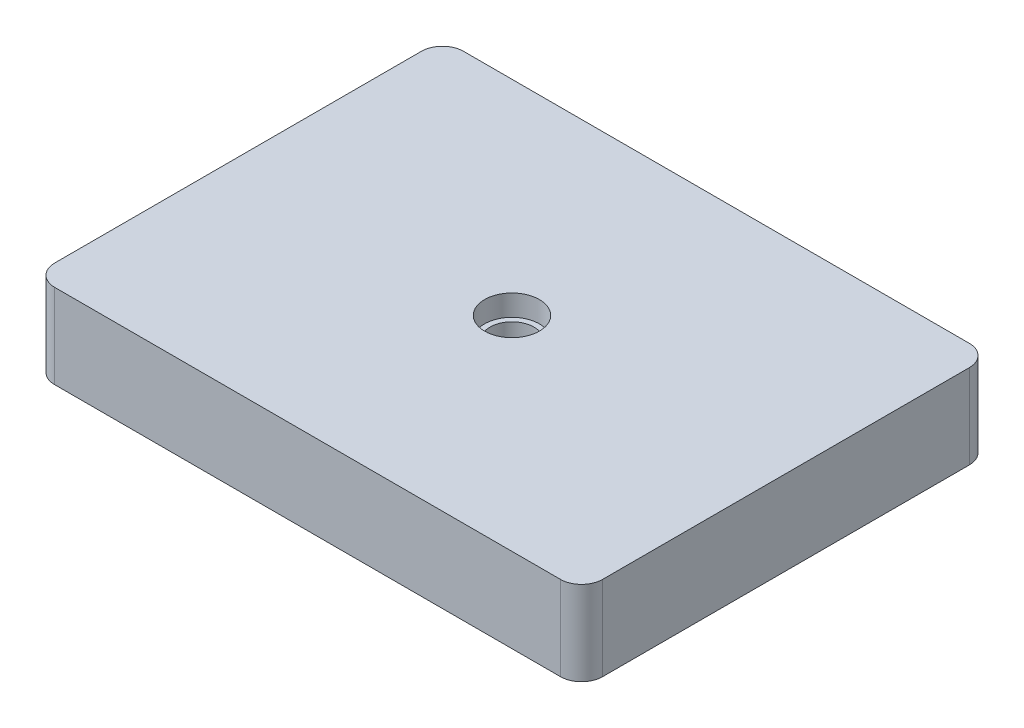
ISO-10303-21;
HEADER;
FILE_DESCRIPTION(('STEP AP214'),'2;1');
FILE_NAME('part.step','',(''),(''),'','','');
FILE_SCHEMA(('AUTOMOTIVE_DESIGN { 1 0 10303 214 1 1 1 1 }'));
ENDSEC;
DATA;
#1=APPLICATION_CONTEXT('core data for automotive mechanical design processes');
#2=APPLICATION_PROTOCOL_DEFINITION('international standard','automotive_design',2000,#1);
#3=PRODUCT_CONTEXT('',#1,'mechanical');
#4=PRODUCT('Part','Part','',(#3));
#5=PRODUCT_RELATED_PRODUCT_CATEGORY('part','',(#4));
#6=PRODUCT_DEFINITION_FORMATION('','',#4);
#7=PRODUCT_DEFINITION_CONTEXT('part definition',#1,'design');
#8=PRODUCT_DEFINITION('design','',#6,#7);
#9=PRODUCT_DEFINITION_SHAPE('','',#8);
#10=(LENGTH_UNIT() NAMED_UNIT(*) SI_UNIT(.MILLI.,.METRE.));
#11=(NAMED_UNIT(*) PLANE_ANGLE_UNIT() SI_UNIT($,.RADIAN.));
#12=(NAMED_UNIT(*) SI_UNIT($,.STERADIAN.) SOLID_ANGLE_UNIT());
#13=UNCERTAINTY_MEASURE_WITH_UNIT(LENGTH_MEASURE(1.E-05),#10,'distance_accuracy_value','');
#14=(GEOMETRIC_REPRESENTATION_CONTEXT(3) GLOBAL_UNCERTAINTY_ASSIGNED_CONTEXT((#13)) GLOBAL_UNIT_ASSIGNED_CONTEXT((#10,
#11,#12)) REPRESENTATION_CONTEXT('',''));
#15=CARTESIAN_POINT('',(0.,0.,0.));
#16=DIRECTION('',(0.,0.,1.));
#17=DIRECTION('',(1.,0.,0.));
#18=AXIS2_PLACEMENT_3D('',#15,#16,#17);
#19=CARTESIAN_POINT('',(0.,-20.,0.));
#20=DIRECTION('',(0.,1.,0.));
#21=DIRECTION('',(0.,0.,1.));
#22=AXIS2_PLACEMENT_3D('',#19,#20,#21);
#23=CYLINDRICAL_SURFACE('',#22,5.2);
#24=CARTESIAN_POINT('',(0.,-20.,0.));
#25=DIRECTION('',(0.,1.,0.));
#26=DIRECTION('',(0.,0.,1.));
#27=AXIS2_PLACEMENT_3D('',#24,#25,#26);
#28=CIRCLE('',#27,5.2);
#29=CARTESIAN_POINT('',(0.,-20.,5.2));
#30=VERTEX_POINT('',#29);
#31=EDGE_CURVE('E177',#30,#30,#28,.T.);
#32=ORIENTED_EDGE('',*,*,#31,.F.);
#33=EDGE_LOOP('',(#32));
#34=FACE_BOUND('',#33,.T.);
#35=CARTESIAN_POINT('',(0.,-5.,0.));
#36=DIRECTION('',(0.,1.,0.));
#37=DIRECTION('',(0.,0.,1.));
#38=AXIS2_PLACEMENT_3D('',#35,#36,#37);
#39=CIRCLE('',#38,5.2);
#40=CARTESIAN_POINT('',(0.,-5.,5.2));
#41=VERTEX_POINT('',#40);
#42=EDGE_CURVE('E139',#41,#41,#39,.F.);
#43=ORIENTED_EDGE('',*,*,#42,.F.);
#44=EDGE_LOOP('',(#43));
#45=FACE_BOUND('',#44,.T.);
#46=ADVANCED_FACE('F41',(#34,#45),#23,.F.);
#47=CARTESIAN_POINT('',(65.,-20.,48.5));
#48=DIRECTION('',(1.,0.,0.));
#49=DIRECTION('',(0.,0.,-1.));
#50=AXIS2_PLACEMENT_3D('',#47,#48,#49);
#51=PLANE('',#50);
#52=DIRECTION('',(0.,0.,-1.));
#53=VECTOR('',#52,1.);
#54=CARTESIAN_POINT('',(65.,-20.,48.5));
#55=LINE('',#54,#53);
#56=CARTESIAN_POINT('',(65.,-20.,43.5));
#57=VERTEX_POINT('',#56);
#58=CARTESIAN_POINT('',(65.,-20.,-43.5));
#59=VERTEX_POINT('',#58);
#60=EDGE_CURVE('E164',#57,#59,#55,.T.);
#61=ORIENTED_EDGE('',*,*,#60,.T.);
#62=DIRECTION('',(0.,1.,0.));
#63=VECTOR('',#62,1.);
#64=CARTESIAN_POINT('',(65.,-20.,-43.5));
#65=LINE('',#64,#63);
#66=CARTESIAN_POINT('',(65.,0.,-43.5));
#67=VERTEX_POINT('',#66);
#68=EDGE_CURVE('E11',#59,#67,#65,.T.);
#69=ORIENTED_EDGE('',*,*,#68,.T.);
#70=DIRECTION('',(0.,0.,-1.));
#71=VECTOR('',#70,1.);
#72=CARTESIAN_POINT('',(65.,0.,48.5));
#73=LINE('',#72,#71);
#74=CARTESIAN_POINT('',(65.,0.,43.5));
#75=VERTEX_POINT('',#74);
#76=EDGE_CURVE('E113',#75,#67,#73,.T.);
#77=ORIENTED_EDGE('',*,*,#76,.F.);
#78=DIRECTION('',(0.,1.,0.));
#79=VECTOR('',#78,1.);
#80=CARTESIAN_POINT('',(65.,-20.,43.5));
#81=LINE('',#80,#79);
#82=EDGE_CURVE('E49',#75,#57,#81,.F.);
#83=ORIENTED_EDGE('',*,*,#82,.T.);
#84=EDGE_LOOP('',(#61,#69,#77,#83));
#85=FACE_BOUND('',#84,.T.);
#86=ADVANCED_FACE('F163',(#85),#51,.T.);
#87=CARTESIAN_POINT('',(-65.,-20.,48.5));
#88=DIRECTION('',(0.,0.,1.));
#89=DIRECTION('',(1.,0.,0.));
#90=AXIS2_PLACEMENT_3D('',#87,#88,#89);
#91=PLANE('',#90);
#92=DIRECTION('',(1.,0.,0.));
#93=VECTOR('',#92,1.);
#94=CARTESIAN_POINT('',(-65.,0.,48.5));
#95=LINE('',#94,#93);
#96=CARTESIAN_POINT('',(-60.,0.,48.5));
#97=VERTEX_POINT('',#96);
#98=CARTESIAN_POINT('',(60.,0.,48.5));
#99=VERTEX_POINT('',#98);
#100=EDGE_CURVE('E169',#97,#99,#95,.T.);
#101=ORIENTED_EDGE('',*,*,#100,.F.);
#102=DIRECTION('',(0.,1.,0.));
#103=VECTOR('',#102,1.);
#104=CARTESIAN_POINT('',(-60.,-20.,48.5));
#105=LINE('',#104,#103);
#106=CARTESIAN_POINT('',(-60.,-20.,48.5));
#107=VERTEX_POINT('',#106);
#108=EDGE_CURVE('E63',#97,#107,#105,.F.);
#109=ORIENTED_EDGE('',*,*,#108,.T.);
#110=DIRECTION('',(1.,0.,0.));
#111=VECTOR('',#110,1.);
#112=CARTESIAN_POINT('',(-65.,-20.,48.5));
#113=LINE('',#112,#111);
#114=CARTESIAN_POINT('',(60.,-20.,48.5));
#115=VERTEX_POINT('',#114);
#116=EDGE_CURVE('E133',#107,#115,#113,.T.);
#117=ORIENTED_EDGE('',*,*,#116,.T.);
#118=DIRECTION('',(0.,1.,0.));
#119=VECTOR('',#118,1.);
#120=CARTESIAN_POINT('',(60.,-20.,48.5));
#121=LINE('',#120,#119);
#122=EDGE_CURVE('E157',#115,#99,#121,.T.);
#123=ORIENTED_EDGE('',*,*,#122,.T.);
#124=EDGE_LOOP('',(#101,#109,#117,#123));
#125=FACE_BOUND('',#124,.T.);
#126=ADVANCED_FACE('F173',(#125),#91,.T.);
#127=CARTESIAN_POINT('',(-65.,-20.,48.5));
#128=DIRECTION('',(-1.,0.,0.));
#129=DIRECTION('',(0.,0.,1.));
#130=AXIS2_PLACEMENT_3D('',#127,#128,#129);
#131=PLANE('',#130);
#132=DIRECTION('',(0.,0.,1.));
#133=VECTOR('',#132,1.);
#134=CARTESIAN_POINT('',(-65.,0.,48.5));
#135=LINE('',#134,#133);
#136=CARTESIAN_POINT('',(-65.,0.,-43.5));
#137=VERTEX_POINT('',#136);
#138=CARTESIAN_POINT('',(-65.,0.,43.5));
#139=VERTEX_POINT('',#138);
#140=EDGE_CURVE('E128',#137,#139,#135,.T.);
#141=ORIENTED_EDGE('',*,*,#140,.F.);
#142=DIRECTION('',(0.,1.,0.));
#143=VECTOR('',#142,1.);
#144=CARTESIAN_POINT('',(-65.,-20.,-43.5));
#145=LINE('',#144,#143);
#146=CARTESIAN_POINT('',(-65.,-20.,-43.5));
#147=VERTEX_POINT('',#146);
#148=EDGE_CURVE('E149',#137,#147,#145,.F.);
#149=ORIENTED_EDGE('',*,*,#148,.T.);
#150=DIRECTION('',(0.,0.,1.));
#151=VECTOR('',#150,1.);
#152=CARTESIAN_POINT('',(-65.,-20.,48.5));
#153=LINE('',#152,#151);
#154=CARTESIAN_POINT('',(-65.,-20.,43.5));
#155=VERTEX_POINT('',#154);
#156=EDGE_CURVE('E136',#147,#155,#153,.T.);
#157=ORIENTED_EDGE('',*,*,#156,.T.);
#158=DIRECTION('',(0.,1.,0.));
#159=VECTOR('',#158,1.);
#160=CARTESIAN_POINT('',(-65.,-20.,43.5));
#161=LINE('',#160,#159);
#162=EDGE_CURVE('E146',#155,#139,#161,.T.);
#163=ORIENTED_EDGE('',*,*,#162,.T.);
#164=EDGE_LOOP('',(#141,#149,#157,#163));
#165=FACE_BOUND('',#164,.T.);
#166=ADVANCED_FACE('F217',(#165),#131,.T.);
#167=CARTESIAN_POINT('',(-65.,-20.,-48.5));
#168=DIRECTION('',(0.,0.,-1.));
#169=DIRECTION('',(-1.,0.,0.));
#170=AXIS2_PLACEMENT_3D('',#167,#168,#169);
#171=PLANE('',#170);
#172=DIRECTION('',(-1.,0.,0.));
#173=VECTOR('',#172,1.);
#174=CARTESIAN_POINT('',(-65.,-20.,-48.5));
#175=LINE('',#174,#173);
#176=CARTESIAN_POINT('',(60.,-20.,-48.5));
#177=VERTEX_POINT('',#176);
#178=CARTESIAN_POINT('',(-60.,-20.,-48.5));
#179=VERTEX_POINT('',#178);
#180=EDGE_CURVE('E168',#177,#179,#175,.T.);
#181=ORIENTED_EDGE('',*,*,#180,.T.);
#182=DIRECTION('',(0.,1.,0.));
#183=VECTOR('',#182,1.);
#184=CARTESIAN_POINT('',(-60.,-20.,-48.5));
#185=LINE('',#184,#183);
#186=CARTESIAN_POINT('',(-60.,0.,-48.5));
#187=VERTEX_POINT('',#186);
#188=EDGE_CURVE('E127',#179,#187,#185,.T.);
#189=ORIENTED_EDGE('',*,*,#188,.T.);
#190=DIRECTION('',(-1.,0.,0.));
#191=VECTOR('',#190,1.);
#192=CARTESIAN_POINT('',(-65.,0.,-48.5));
#193=LINE('',#192,#191);
#194=CARTESIAN_POINT('',(60.,0.,-48.5));
#195=VERTEX_POINT('',#194);
#196=EDGE_CURVE('E111',#195,#187,#193,.T.);
#197=ORIENTED_EDGE('',*,*,#196,.F.);
#198=DIRECTION('',(0.,1.,0.));
#199=VECTOR('',#198,1.);
#200=CARTESIAN_POINT('',(60.,-20.,-48.5));
#201=LINE('',#200,#199);
#202=EDGE_CURVE('E124',#195,#177,#201,.F.);
#203=ORIENTED_EDGE('',*,*,#202,.T.);
#204=EDGE_LOOP('',(#181,#189,#197,#203));
#205=FACE_BOUND('',#204,.T.);
#206=ADVANCED_FACE('F123',(#205),#171,.T.);
#207=CARTESIAN_POINT('',(0.,-20.,0.));
#208=DIRECTION('',(0.,-1.,0.));
#209=DIRECTION('',(0.,0.,-1.));
#210=AXIS2_PLACEMENT_3D('',#207,#208,#209);
#211=PLANE('',#210);
#212=ORIENTED_EDGE('',*,*,#31,.T.);
#213=EDGE_LOOP('',(#212));
#214=FACE_BOUND('',#213,.T.);
#215=ORIENTED_EDGE('',*,*,#156,.F.);
#216=CARTESIAN_POINT('',(-60.,-20.,-43.5));
#217=DIRECTION('',(0.,-1.,0.));
#218=DIRECTION('',(0.,0.,-1.));
#219=AXIS2_PLACEMENT_3D('',#216,#217,#218);
#220=CIRCLE('',#219,5.);
#221=EDGE_CURVE('E155',#147,#179,#220,.T.);
#222=ORIENTED_EDGE('',*,*,#221,.T.);
#223=ORIENTED_EDGE('',*,*,#180,.F.);
#224=CARTESIAN_POINT('',(60.,-20.,-43.5));
#225=DIRECTION('',(0.,-1.,0.));
#226=DIRECTION('',(0.,0.,-1.));
#227=AXIS2_PLACEMENT_3D('',#224,#225,#226);
#228=CIRCLE('',#227,5.);
#229=EDGE_CURVE('E132',#177,#59,#228,.T.);
#230=ORIENTED_EDGE('',*,*,#229,.T.);
#231=ORIENTED_EDGE('',*,*,#60,.F.);
#232=CARTESIAN_POINT('',(60.,-20.,43.5));
#233=DIRECTION('',(0.,-1.,0.));
#234=DIRECTION('',(0.,0.,-1.));
#235=AXIS2_PLACEMENT_3D('',#232,#233,#234);
#236=CIRCLE('',#235,5.);
#237=EDGE_CURVE('E56',#57,#115,#236,.T.);
#238=ORIENTED_EDGE('',*,*,#237,.T.);
#239=ORIENTED_EDGE('',*,*,#116,.F.);
#240=CARTESIAN_POINT('',(-60.,-20.,43.5));
#241=DIRECTION('',(0.,-1.,0.));
#242=DIRECTION('',(0.,0.,-1.));
#243=AXIS2_PLACEMENT_3D('',#240,#241,#242);
#244=CIRCLE('',#243,5.);
#245=EDGE_CURVE('E153',#107,#155,#244,.T.);
#246=ORIENTED_EDGE('',*,*,#245,.T.);
#247=EDGE_LOOP('',(#215,#222,#223,#230,#231,#238,#239,#246));
#248=FACE_BOUND('',#247,.T.);
#249=ADVANCED_FACE('F167',(#214,#248),#211,.T.);
#250=CARTESIAN_POINT('',(0.,0.,0.));
#251=DIRECTION('',(0.,-1.,0.));
#252=DIRECTION('',(0.,0.,-1.));
#253=AXIS2_PLACEMENT_3D('',#250,#251,#252);
#254=PLANE('',#253);
#255=CARTESIAN_POINT('',(0.,0.,0.));
#256=DIRECTION('',(0.,1.,0.));
#257=DIRECTION('',(0.,0.,1.));
#258=AXIS2_PLACEMENT_3D('',#255,#256,#257);
#259=CIRCLE('',#258,6.5);
#260=CARTESIAN_POINT('',(0.,0.,6.5));
#261=VERTEX_POINT('',#260);
#262=EDGE_CURVE('E184',#261,#261,#259,.T.);
#263=ORIENTED_EDGE('',*,*,#262,.F.);
#264=EDGE_LOOP('',(#263));
#265=FACE_BOUND('',#264,.T.);
#266=ORIENTED_EDGE('',*,*,#196,.T.);
#267=CARTESIAN_POINT('',(-60.,0.,-43.5));
#268=DIRECTION('',(0.,-1.,0.));
#269=DIRECTION('',(0.,0.,-1.));
#270=AXIS2_PLACEMENT_3D('',#267,#268,#269);
#271=CIRCLE('',#270,5.);
#272=EDGE_CURVE('E144',#187,#137,#271,.F.);
#273=ORIENTED_EDGE('',*,*,#272,.T.);
#274=ORIENTED_EDGE('',*,*,#140,.T.);
#275=CARTESIAN_POINT('',(-60.,0.,43.5));
#276=DIRECTION('',(0.,-1.,0.));
#277=DIRECTION('',(0.,0.,-1.));
#278=AXIS2_PLACEMENT_3D('',#275,#276,#277);
#279=CIRCLE('',#278,5.);
#280=EDGE_CURVE('E117',#139,#97,#279,.F.);
#281=ORIENTED_EDGE('',*,*,#280,.T.);
#282=ORIENTED_EDGE('',*,*,#100,.T.);
#283=CARTESIAN_POINT('',(60.,0.,43.5));
#284=DIRECTION('',(0.,-1.,0.));
#285=DIRECTION('',(0.,0.,-1.));
#286=AXIS2_PLACEMENT_3D('',#283,#284,#285);
#287=CIRCLE('',#286,5.);
#288=EDGE_CURVE('E118',#99,#75,#287,.F.);
#289=ORIENTED_EDGE('',*,*,#288,.T.);
#290=ORIENTED_EDGE('',*,*,#76,.T.);
#291=CARTESIAN_POINT('',(60.,0.,-43.5));
#292=DIRECTION('',(0.,-1.,0.));
#293=DIRECTION('',(0.,0.,-1.));
#294=AXIS2_PLACEMENT_3D('',#291,#292,#293);
#295=CIRCLE('',#294,5.);
#296=EDGE_CURVE('E108',#67,#195,#295,.F.);
#297=ORIENTED_EDGE('',*,*,#296,.T.);
#298=EDGE_LOOP('',(#266,#273,#274,#281,#282,#289,#290,#297));
#299=FACE_BOUND('',#298,.T.);
#300=ADVANCED_FACE('F110',(#265,#299),#254,.F.);
#301=CARTESIAN_POINT('',(0.,-5.,0.));
#302=DIRECTION('',(0.,1.,0.));
#303=DIRECTION('',(0.,0.,1.));
#304=AXIS2_PLACEMENT_3D('',#301,#302,#303);
#305=PLANE('',#304);
#306=CARTESIAN_POINT('',(0.,-5.,0.));
#307=DIRECTION('',(0.,1.,0.));
#308=DIRECTION('',(0.,0.,1.));
#309=AXIS2_PLACEMENT_3D('',#306,#307,#308);
#310=CIRCLE('',#309,6.5);
#311=CARTESIAN_POINT('',(0.,-5.,6.5));
#312=VERTEX_POINT('',#311);
#313=EDGE_CURVE('E187',#312,#312,#310,.T.);
#314=ORIENTED_EDGE('',*,*,#313,.T.);
#315=EDGE_LOOP('',(#314));
#316=FACE_BOUND('',#315,.T.);
#317=ORIENTED_EDGE('',*,*,#42,.T.);
#318=EDGE_LOOP('',(#317));
#319=FACE_BOUND('',#318,.T.);
#320=ADVANCED_FACE('F194',(#316,#319),#305,.T.);
#321=CARTESIAN_POINT('',(0.,-5.,0.));
#322=DIRECTION('',(0.,1.,0.));
#323=DIRECTION('',(0.,0.,1.));
#324=AXIS2_PLACEMENT_3D('',#321,#322,#323);
#325=CYLINDRICAL_SURFACE('',#324,6.5);
#326=ORIENTED_EDGE('',*,*,#313,.F.);
#327=EDGE_LOOP('',(#326));
#328=FACE_BOUND('',#327,.T.);
#329=ORIENTED_EDGE('',*,*,#262,.T.);
#330=EDGE_LOOP('',(#329));
#331=FACE_BOUND('',#330,.T.);
#332=ADVANCED_FACE('F207',(#328,#331),#325,.F.);
#333=CARTESIAN_POINT('',(-60.,-20.,-43.5));
#334=DIRECTION('',(0.,1.,0.));
#335=DIRECTION('',(0.,0.,1.));
#336=AXIS2_PLACEMENT_3D('',#333,#334,#335);
#337=CYLINDRICAL_SURFACE('',#336,5.);
#338=ORIENTED_EDGE('',*,*,#221,.F.);
#339=ORIENTED_EDGE('',*,*,#148,.F.);
#340=ORIENTED_EDGE('',*,*,#272,.F.);
#341=ORIENTED_EDGE('',*,*,#188,.F.);
#342=EDGE_LOOP('',(#338,#339,#340,#341));
#343=FACE_BOUND('',#342,.T.);
#344=ADVANCED_FACE('F223',(#343),#337,.T.);
#345=CARTESIAN_POINT('',(-60.,-20.,43.5));
#346=DIRECTION('',(0.,1.,0.));
#347=DIRECTION('',(0.,0.,1.));
#348=AXIS2_PLACEMENT_3D('',#345,#346,#347);
#349=CYLINDRICAL_SURFACE('',#348,5.);
#350=ORIENTED_EDGE('',*,*,#245,.F.);
#351=ORIENTED_EDGE('',*,*,#108,.F.);
#352=ORIENTED_EDGE('',*,*,#280,.F.);
#353=ORIENTED_EDGE('',*,*,#162,.F.);
#354=EDGE_LOOP('',(#350,#351,#352,#353));
#355=FACE_BOUND('',#354,.T.);
#356=ADVANCED_FACE('F226',(#355),#349,.T.);
#357=CARTESIAN_POINT('',(60.,-20.,-43.5));
#358=DIRECTION('',(0.,1.,0.));
#359=DIRECTION('',(0.,0.,1.));
#360=AXIS2_PLACEMENT_3D('',#357,#358,#359);
#361=CYLINDRICAL_SURFACE('',#360,5.);
#362=ORIENTED_EDGE('',*,*,#229,.F.);
#363=ORIENTED_EDGE('',*,*,#202,.F.);
#364=ORIENTED_EDGE('',*,*,#296,.F.);
#365=ORIENTED_EDGE('',*,*,#68,.F.);
#366=EDGE_LOOP('',(#362,#363,#364,#365));
#367=FACE_BOUND('',#366,.T.);
#368=ADVANCED_FACE('F131',(#367),#361,.T.);
#369=CARTESIAN_POINT('',(60.,-20.,43.5));
#370=DIRECTION('',(0.,1.,0.));
#371=DIRECTION('',(0.,0.,1.));
#372=AXIS2_PLACEMENT_3D('',#369,#370,#371);
#373=CYLINDRICAL_SURFACE('',#372,5.);
#374=ORIENTED_EDGE('',*,*,#237,.F.);
#375=ORIENTED_EDGE('',*,*,#82,.F.);
#376=ORIENTED_EDGE('',*,*,#288,.F.);
#377=ORIENTED_EDGE('',*,*,#122,.F.);
#378=EDGE_LOOP('',(#374,#375,#376,#377));
#379=FACE_BOUND('',#378,.T.);
#380=ADVANCED_FACE('F43',(#379),#373,.T.);
#381=CLOSED_SHELL('',(#46,#86,#126,#166,#206,#249,#300,#320,#332,#344,#356,#368,#380));
#382=MANIFOLD_SOLID_BREP('B2',#381);
#383=ADVANCED_BREP_SHAPE_REPRESENTATION('',(#18,#382),#14);
#384=SHAPE_DEFINITION_REPRESENTATION(#9,#383);
ENDSEC;
END-ISO-10303-21;
